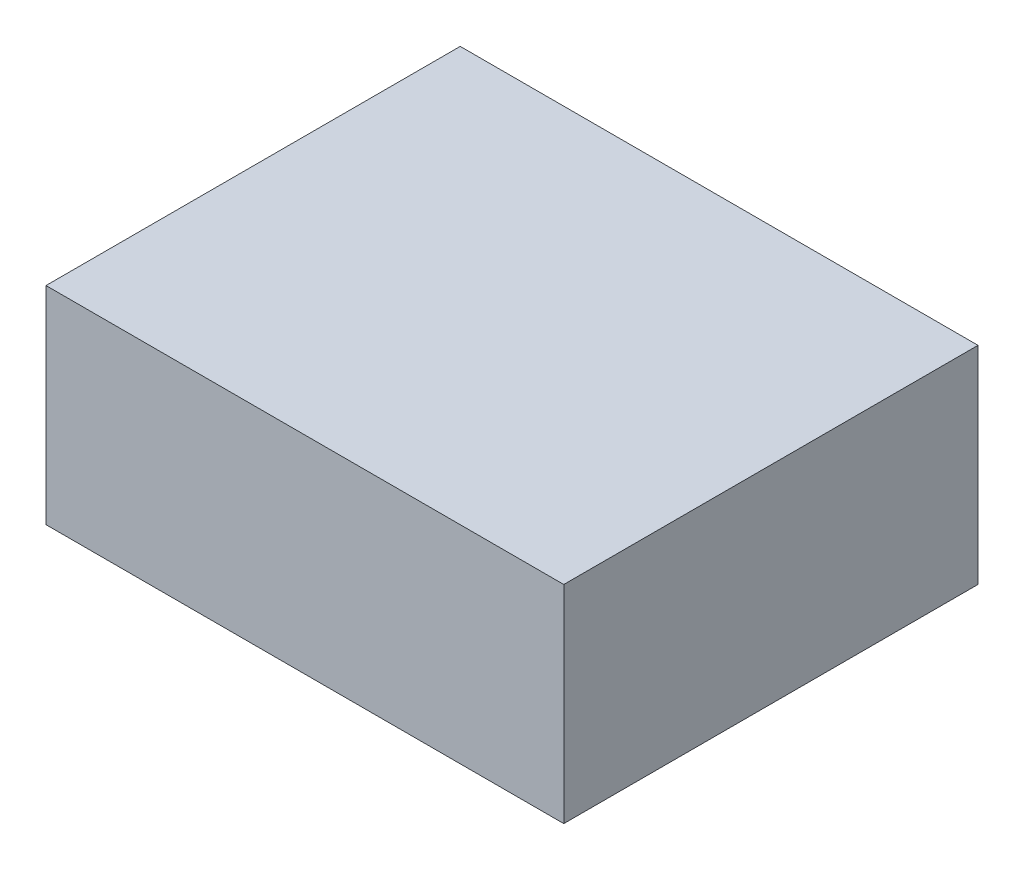
ISO-10303-21;
HEADER;
FILE_DESCRIPTION(('STEP AP214'),'2;1');
FILE_NAME('part.step','',(''),(''),'','','');
FILE_SCHEMA(('AUTOMOTIVE_DESIGN { 1 0 10303 214 1 1 1 1 }'));
ENDSEC;
DATA;
#1=APPLICATION_CONTEXT('core data for automotive mechanical design processes');
#2=APPLICATION_PROTOCOL_DEFINITION('international standard','automotive_design',2000,#1);
#3=PRODUCT_CONTEXT('',#1,'mechanical');
#4=PRODUCT('Part','Part','',(#3));
#5=PRODUCT_RELATED_PRODUCT_CATEGORY('part','',(#4));
#6=PRODUCT_DEFINITION_FORMATION('','',#4);
#7=PRODUCT_DEFINITION_CONTEXT('part definition',#1,'design');
#8=PRODUCT_DEFINITION('design','',#6,#7);
#9=PRODUCT_DEFINITION_SHAPE('','',#8);
#10=(LENGTH_UNIT() NAMED_UNIT(*) SI_UNIT(.MILLI.,.METRE.));
#11=(NAMED_UNIT(*) PLANE_ANGLE_UNIT() SI_UNIT($,.RADIAN.));
#12=(NAMED_UNIT(*) SI_UNIT($,.STERADIAN.) SOLID_ANGLE_UNIT());
#13=UNCERTAINTY_MEASURE_WITH_UNIT(LENGTH_MEASURE(1.E-05),#10,'distance_accuracy_value','');
#14=(GEOMETRIC_REPRESENTATION_CONTEXT(3) GLOBAL_UNCERTAINTY_ASSIGNED_CONTEXT((#13)) GLOBAL_UNIT_ASSIGNED_CONTEXT((#10,
#11,#12)) REPRESENTATION_CONTEXT('',''));
#15=CARTESIAN_POINT('',(0.,0.,0.));
#16=DIRECTION('',(0.,0.,1.));
#17=DIRECTION('',(1.,0.,0.));
#18=AXIS2_PLACEMENT_3D('',#15,#16,#17);
#19=CARTESIAN_POINT('',(0.,0.,76.2));
#20=DIRECTION('',(1.,0.,0.));
#21=DIRECTION('',(0.,0.,-1.));
#22=AXIS2_PLACEMENT_3D('',#19,#20,#21);
#23=PLANE('',#22);
#24=DIRECTION('',(0.,-1.,0.));
#25=VECTOR('',#24,1.);
#26=CARTESIAN_POINT('',(0.,0.,0.));
#27=LINE('',#26,#25);
#28=CARTESIAN_POINT('',(0.,38.1,0.));
#29=VERTEX_POINT('',#28);
#30=CARTESIAN_POINT('',(0.,0.,0.));
#31=VERTEX_POINT('',#30);
#32=EDGE_CURVE('E109',#29,#31,#27,.T.);
#33=ORIENTED_EDGE('',*,*,#32,.T.);
#34=DIRECTION('',(0.,0.,-1.));
#35=VECTOR('',#34,1.);
#36=CARTESIAN_POINT('',(0.,0.,76.2));
#37=LINE('',#36,#35);
#38=CARTESIAN_POINT('',(0.,0.,76.2));
#39=VERTEX_POINT('',#38);
#40=EDGE_CURVE('E11',#39,#31,#37,.T.);
#41=ORIENTED_EDGE('',*,*,#40,.F.);
#42=DIRECTION('',(0.,-1.,0.));
#43=VECTOR('',#42,1.);
#44=CARTESIAN_POINT('',(0.,0.,76.2));
#45=LINE('',#44,#43);
#46=CARTESIAN_POINT('',(0.,38.1,76.2));
#47=VERTEX_POINT('',#46);
#48=EDGE_CURVE('E93',#47,#39,#45,.T.);
#49=ORIENTED_EDGE('',*,*,#48,.F.);
#50=DIRECTION('',(0.,0.,-1.));
#51=VECTOR('',#50,1.);
#52=CARTESIAN_POINT('',(0.,38.1,76.2));
#53=LINE('',#52,#51);
#54=EDGE_CURVE('E105',#47,#29,#53,.T.);
#55=ORIENTED_EDGE('',*,*,#54,.T.);
#56=EDGE_LOOP('',(#33,#41,#49,#55));
#57=FACE_BOUND('',#56,.T.);
#58=ADVANCED_FACE('F41',(#57),#23,.F.);
#59=CARTESIAN_POINT('',(0.,0.,76.2));
#60=DIRECTION('',(0.,1.,0.));
#61=DIRECTION('',(0.,0.,1.));
#62=AXIS2_PLACEMENT_3D('',#59,#60,#61);
#63=PLANE('',#62);
#64=DIRECTION('',(1.,0.,0.));
#65=VECTOR('',#64,1.);
#66=CARTESIAN_POINT('',(0.,0.,0.));
#67=LINE('',#66,#65);
#68=CARTESIAN_POINT('',(95.25,0.,0.));
#69=VERTEX_POINT('',#68);
#70=EDGE_CURVE('E98',#31,#69,#67,.T.);
#71=ORIENTED_EDGE('',*,*,#70,.T.);
#72=DIRECTION('',(0.,0.,-1.));
#73=VECTOR('',#72,1.);
#74=CARTESIAN_POINT('',(95.25,0.,76.2));
#75=LINE('',#74,#73);
#76=CARTESIAN_POINT('',(95.25,0.,76.2));
#77=VERTEX_POINT('',#76);
#78=EDGE_CURVE('E50',#77,#69,#75,.T.);
#79=ORIENTED_EDGE('',*,*,#78,.F.);
#80=DIRECTION('',(1.,0.,0.));
#81=VECTOR('',#80,1.);
#82=CARTESIAN_POINT('',(0.,0.,76.2));
#83=LINE('',#82,#81);
#84=EDGE_CURVE('E88',#39,#77,#83,.T.);
#85=ORIENTED_EDGE('',*,*,#84,.F.);
#86=ORIENTED_EDGE('',*,*,#40,.T.);
#87=EDGE_LOOP('',(#71,#79,#85,#86));
#88=FACE_BOUND('',#87,.T.);
#89=ADVANCED_FACE('F97',(#88),#63,.F.);
#90=CARTESIAN_POINT('',(95.25,0.,76.2));
#91=DIRECTION('',(-1.,0.,0.));
#92=DIRECTION('',(0.,0.,1.));
#93=AXIS2_PLACEMENT_3D('',#90,#91,#92);
#94=PLANE('',#93);
#95=DIRECTION('',(0.,1.,0.));
#96=VECTOR('',#95,1.);
#97=CARTESIAN_POINT('',(95.25,0.,0.));
#98=LINE('',#97,#96);
#99=CARTESIAN_POINT('',(95.25,38.1,0.));
#100=VERTEX_POINT('',#99);
#101=EDGE_CURVE('E75',#69,#100,#98,.T.);
#102=ORIENTED_EDGE('',*,*,#101,.T.);
#103=DIRECTION('',(0.,0.,-1.));
#104=VECTOR('',#103,1.);
#105=CARTESIAN_POINT('',(95.25,38.1,76.2));
#106=LINE('',#105,#104);
#107=CARTESIAN_POINT('',(95.25,38.1,76.2));
#108=VERTEX_POINT('',#107);
#109=EDGE_CURVE('E100',#108,#100,#106,.T.);
#110=ORIENTED_EDGE('',*,*,#109,.F.);
#111=DIRECTION('',(0.,1.,0.));
#112=VECTOR('',#111,1.);
#113=CARTESIAN_POINT('',(95.25,0.,76.2));
#114=LINE('',#113,#112);
#115=EDGE_CURVE('E91',#77,#108,#114,.T.);
#116=ORIENTED_EDGE('',*,*,#115,.F.);
#117=ORIENTED_EDGE('',*,*,#78,.T.);
#118=EDGE_LOOP('',(#102,#110,#116,#117));
#119=FACE_BOUND('',#118,.T.);
#120=ADVANCED_FACE('F101',(#119),#94,.F.);
#121=CARTESIAN_POINT('',(0.,38.1,76.2));
#122=DIRECTION('',(0.,-1.,0.));
#123=DIRECTION('',(0.,0.,-1.));
#124=AXIS2_PLACEMENT_3D('',#121,#122,#123);
#125=PLANE('',#124);
#126=DIRECTION('',(-1.,0.,0.));
#127=VECTOR('',#126,1.);
#128=CARTESIAN_POINT('',(0.,38.1,0.));
#129=LINE('',#128,#127);
#130=EDGE_CURVE('E81',#100,#29,#129,.T.);
#131=ORIENTED_EDGE('',*,*,#130,.T.);
#132=ORIENTED_EDGE('',*,*,#54,.F.);
#133=DIRECTION('',(-1.,0.,0.));
#134=VECTOR('',#133,1.);
#135=CARTESIAN_POINT('',(0.,38.1,76.2));
#136=LINE('',#135,#134);
#137=EDGE_CURVE('E58',#108,#47,#136,.T.);
#138=ORIENTED_EDGE('',*,*,#137,.F.);
#139=ORIENTED_EDGE('',*,*,#109,.T.);
#140=EDGE_LOOP('',(#131,#132,#138,#139));
#141=FACE_BOUND('',#140,.T.);
#142=ADVANCED_FACE('F122',(#141),#125,.F.);
#143=CARTESIAN_POINT('',(0.,0.,76.2));
#144=DIRECTION('',(0.,0.,-1.));
#145=DIRECTION('',(-1.,0.,0.));
#146=AXIS2_PLACEMENT_3D('',#143,#144,#145);
#147=PLANE('',#146);
#148=ORIENTED_EDGE('',*,*,#48,.T.);
#149=ORIENTED_EDGE('',*,*,#84,.T.);
#150=ORIENTED_EDGE('',*,*,#115,.T.);
#151=ORIENTED_EDGE('',*,*,#137,.T.);
#152=EDGE_LOOP('',(#148,#149,#150,#151));
#153=FACE_BOUND('',#152,.T.);
#154=ADVANCED_FACE('F89',(#153),#147,.F.);
#155=CARTESIAN_POINT('',(0.,0.,0.));
#156=DIRECTION('',(0.,0.,-1.));
#157=DIRECTION('',(-1.,0.,0.));
#158=AXIS2_PLACEMENT_3D('',#155,#156,#157);
#159=PLANE('',#158);
#160=ORIENTED_EDGE('',*,*,#32,.F.);
#161=ORIENTED_EDGE('',*,*,#130,.F.);
#162=ORIENTED_EDGE('',*,*,#101,.F.);
#163=ORIENTED_EDGE('',*,*,#70,.F.);
#164=EDGE_LOOP('',(#160,#161,#162,#163));
#165=FACE_BOUND('',#164,.T.);
#166=ADVANCED_FACE('F125',(#165),#159,.T.);
#167=CLOSED_SHELL('',(#58,#89,#120,#142,#154,#166));
#168=MANIFOLD_SOLID_BREP('B2',#167);
#169=ADVANCED_BREP_SHAPE_REPRESENTATION('',(#18,#168),#14);
#170=SHAPE_DEFINITION_REPRESENTATION(#9,#169);
ENDSEC;
END-ISO-10303-21;
